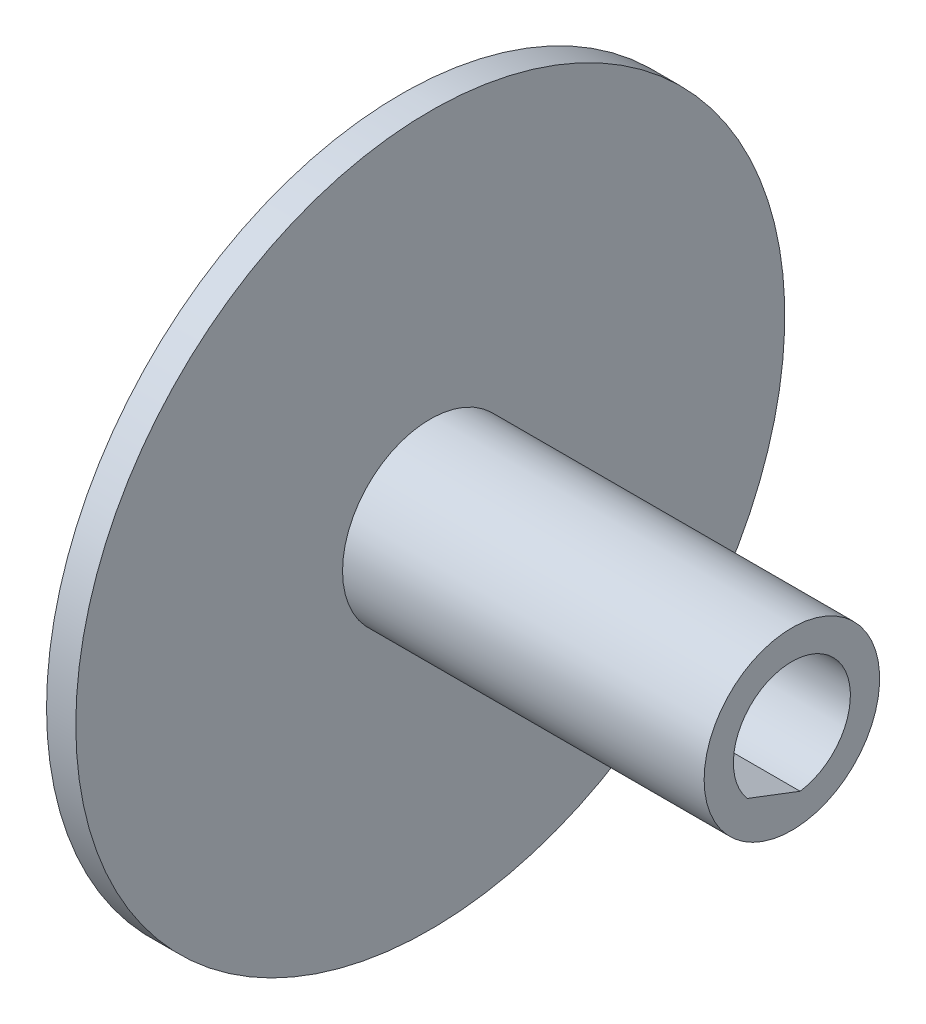
ISO-10303-21;
HEADER;
FILE_DESCRIPTION(('STEP AP214'),'2;1');
FILE_NAME('part.step','',(''),(''),'','','');
FILE_SCHEMA(('AUTOMOTIVE_DESIGN { 1 0 10303 214 1 1 1 1 }'));
ENDSEC;
DATA;
#1=APPLICATION_CONTEXT('core data for automotive mechanical design processes');
#2=APPLICATION_PROTOCOL_DEFINITION('international standard','automotive_design',2000,#1);
#3=PRODUCT_CONTEXT('',#1,'mechanical');
#4=PRODUCT('Part','Part','',(#3));
#5=PRODUCT_RELATED_PRODUCT_CATEGORY('part','',(#4));
#6=PRODUCT_DEFINITION_FORMATION('','',#4);
#7=PRODUCT_DEFINITION_CONTEXT('part definition',#1,'design');
#8=PRODUCT_DEFINITION('design','',#6,#7);
#9=PRODUCT_DEFINITION_SHAPE('','',#8);
#10=(LENGTH_UNIT() NAMED_UNIT(*) SI_UNIT(.MILLI.,.METRE.));
#11=(NAMED_UNIT(*) PLANE_ANGLE_UNIT() SI_UNIT($,.RADIAN.));
#12=(NAMED_UNIT(*) SI_UNIT($,.STERADIAN.) SOLID_ANGLE_UNIT());
#13=UNCERTAINTY_MEASURE_WITH_UNIT(LENGTH_MEASURE(1.E-05),#10,'distance_accuracy_value','');
#14=(GEOMETRIC_REPRESENTATION_CONTEXT(3) GLOBAL_UNCERTAINTY_ASSIGNED_CONTEXT((#13)) GLOBAL_UNIT_ASSIGNED_CONTEXT((#10,
#11,#12)) REPRESENTATION_CONTEXT('',''));
#15=CARTESIAN_POINT('',(0.,0.,0.));
#16=DIRECTION('',(0.,0.,1.));
#17=DIRECTION('',(1.,0.,0.));
#18=AXIS2_PLACEMENT_3D('',#15,#16,#17);
#19=CARTESIAN_POINT('',(2.,-2.98540145985401,0.));
#20=DIRECTION('',(-1.,0.,0.));
#21=DIRECTION('',(0.,0.,1.));
#22=AXIS2_PLACEMENT_3D('',#19,#20,#21);
#23=CYLINDRICAL_SURFACE('',#22,4.);
#24=CARTESIAN_POINT('',(2.,-2.98540145985401,0.));
#25=DIRECTION('',(-1.,0.,0.));
#26=DIRECTION('',(0.,0.,1.));
#27=AXIS2_PLACEMENT_3D('',#24,#25,#26);
#28=CIRCLE('',#27,4.);
#29=CARTESIAN_POINT('',(2.,-5.56523637391071,3.05686961060108));
#30=VERTEX_POINT('',#29);
#31=CARTESIAN_POINT('',(2.,-6.94576487212457,-0.561713132077882));
#32=VERTEX_POINT('',#31);
#33=EDGE_CURVE('E11',#30,#32,#28,.T.);
#34=ORIENTED_EDGE('',*,*,#33,.T.);
#35=DIRECTION('',(-1.,0.,0.));
#36=VECTOR('',#35,1.);
#37=CARTESIAN_POINT('',(32.6100738408527,-6.94576487212481,-0.561713132078517));
#38=LINE('',#37,#36);
#39=CARTESIAN_POINT('',(28.7227855910632,-6.94576487212457,-0.56171313207788));
#40=VERTEX_POINT('',#39);
#41=EDGE_CURVE('E61',#40,#32,#38,.T.);
#42=ORIENTED_EDGE('',*,*,#41,.F.);
#43=CARTESIAN_POINT('',(28.7227855910632,-2.98540145985401,0.));
#44=DIRECTION('',(-1.,0.,0.));
#45=DIRECTION('',(0.,0.,1.));
#46=AXIS2_PLACEMENT_3D('',#43,#44,#45);
#47=CIRCLE('',#46,4.);
#48=CARTESIAN_POINT('',(28.7227855910632,-5.56523637391092,3.05686961060052));
#49=VERTEX_POINT('',#48);
#50=EDGE_CURVE('E51',#49,#40,#47,.T.);
#51=ORIENTED_EDGE('',*,*,#50,.F.);
#52=DIRECTION('',(-1.,0.,0.));
#53=VECTOR('',#52,1.);
#54=CARTESIAN_POINT('',(32.6100738408527,-5.56523637391071,3.05686961060108));
#55=LINE('',#54,#53);
#56=EDGE_CURVE('E73',#49,#30,#55,.T.);
#57=ORIENTED_EDGE('',*,*,#56,.T.);
#58=EDGE_LOOP('',(#34,#42,#51,#57));
#59=FACE_BOUND('',#58,.T.);
#60=ADVANCED_FACE('F43',(#59),#23,.F.);
#61=CARTESIAN_POINT('',(28.7227855910632,1.01459854014599,0.));
#62=DIRECTION('',(-1.,0.,0.));
#63=DIRECTION('',(0.,0.,1.));
#64=AXIS2_PLACEMENT_3D('',#61,#62,#63);
#65=PLANE('',#64);
#66=CARTESIAN_POINT('',(28.7227855910632,-2.98540145985401,0.));
#67=DIRECTION('',(-1.,0.,0.));
#68=DIRECTION('',(0.,0.,1.));
#69=AXIS2_PLACEMENT_3D('',#66,#67,#68);
#70=CIRCLE('',#69,6.);
#71=CARTESIAN_POINT('',(28.7227855910632,-2.98540145985401,6.));
#72=VERTEX_POINT('',#71);
#73=EDGE_CURVE('E99',#72,#72,#70,.T.);
#74=ORIENTED_EDGE('',*,*,#73,.F.);
#75=EDGE_LOOP('',(#74));
#76=FACE_BOUND('',#75,.T.);
#77=ORIENTED_EDGE('',*,*,#50,.T.);
#78=DIRECTION('',(0.,0.356450925503198,0.934314046618113));
#79=VECTOR('',#78,1.);
#80=CARTESIAN_POINT('',(28.7227855910632,-6.94576487212481,-0.561713132078517));
#81=LINE('',#80,#79);
#82=EDGE_CURVE('E83',#40,#49,#81,.T.);
#83=ORIENTED_EDGE('',*,*,#82,.T.);
#84=EDGE_LOOP('',(#77,#83));
#85=FACE_BOUND('',#84,.T.);
#86=ADVANCED_FACE('F104',(#76,#85),#65,.F.);
#87=CARTESIAN_POINT('',(2.,-2.98540145985401,0.));
#88=DIRECTION('',(-1.,0.,0.));
#89=DIRECTION('',(0.,0.,1.));
#90=AXIS2_PLACEMENT_3D('',#87,#88,#89);
#91=CYLINDRICAL_SURFACE('',#90,6.);
#92=CARTESIAN_POINT('',(4.,-2.98540145985401,0.));
#93=DIRECTION('',(-1.,0.,0.));
#94=DIRECTION('',(0.,0.,1.));
#95=AXIS2_PLACEMENT_3D('',#92,#93,#94);
#96=CIRCLE('',#95,6.);
#97=CARTESIAN_POINT('',(4.,-2.98540145985401,6.));
#98=VERTEX_POINT('',#97);
#99=EDGE_CURVE('E95',#98,#98,#96,.T.);
#100=ORIENTED_EDGE('',*,*,#99,.F.);
#101=EDGE_LOOP('',(#100));
#102=FACE_BOUND('',#101,.T.);
#103=ORIENTED_EDGE('',*,*,#73,.T.);
#104=EDGE_LOOP('',(#103));
#105=FACE_BOUND('',#104,.T.);
#106=ADVANCED_FACE('F106',(#102,#105),#91,.T.);
#107=CARTESIAN_POINT('',(4.,21.2538194026265,0.));
#108=DIRECTION('',(-1.,0.,0.));
#109=DIRECTION('',(0.,0.,1.));
#110=AXIS2_PLACEMENT_3D('',#107,#108,#109);
#111=PLANE('',#110);
#112=CARTESIAN_POINT('',(4.,-2.98540145985401,0.));
#113=DIRECTION('',(-1.,0.,0.));
#114=DIRECTION('',(0.,0.,1.));
#115=AXIS2_PLACEMENT_3D('',#112,#113,#114);
#116=CIRCLE('',#115,24.2392208624805);
#117=CARTESIAN_POINT('',(4.,-2.98540145985401,24.2392208624805));
#118=VERTEX_POINT('',#117);
#119=EDGE_CURVE('E91',#118,#118,#116,.T.);
#120=ORIENTED_EDGE('',*,*,#119,.F.);
#121=EDGE_LOOP('',(#120));
#122=FACE_BOUND('',#121,.T.);
#123=ORIENTED_EDGE('',*,*,#99,.T.);
#124=EDGE_LOOP('',(#123));
#125=FACE_BOUND('',#124,.T.);
#126=ADVANCED_FACE('F112',(#122,#125),#111,.F.);
#127=CARTESIAN_POINT('',(2.,-2.98540145985401,0.));
#128=DIRECTION('',(-1.,0.,0.));
#129=DIRECTION('',(0.,0.,1.));
#130=AXIS2_PLACEMENT_3D('',#127,#128,#129);
#131=CYLINDRICAL_SURFACE('',#130,24.2392208624805);
#132=CARTESIAN_POINT('',(2.,-2.98540145985401,0.));
#133=DIRECTION('',(-1.,0.,0.));
#134=DIRECTION('',(0.,0.,1.));
#135=AXIS2_PLACEMENT_3D('',#132,#133,#134);
#136=CIRCLE('',#135,24.2392208624805);
#137=CARTESIAN_POINT('',(2.,-2.98540145985401,24.2392208624805));
#138=VERTEX_POINT('',#137);
#139=EDGE_CURVE('E87',#138,#138,#136,.T.);
#140=ORIENTED_EDGE('',*,*,#139,.F.);
#141=EDGE_LOOP('',(#140));
#142=FACE_BOUND('',#141,.T.);
#143=ORIENTED_EDGE('',*,*,#119,.T.);
#144=EDGE_LOOP('',(#143));
#145=FACE_BOUND('',#144,.T.);
#146=ADVANCED_FACE('F119',(#142,#145),#131,.T.);
#147=CARTESIAN_POINT('',(2.,5.01459854014599,0.));
#148=DIRECTION('',(1.,0.,0.));
#149=DIRECTION('',(0.,0.,-1.));
#150=AXIS2_PLACEMENT_3D('',#147,#148,#149);
#151=PLANE('',#150);
#152=ORIENTED_EDGE('',*,*,#33,.F.);
#153=DIRECTION('',(0.,-0.356450925503198,-0.934314046618113));
#154=VECTOR('',#153,1.);
#155=CARTESIAN_POINT('',(2.,-6.94576487212481,-0.561713132078517));
#156=LINE('',#155,#154);
#157=EDGE_CURVE('E71',#30,#32,#156,.T.);
#158=ORIENTED_EDGE('',*,*,#157,.T.);
#159=EDGE_LOOP('',(#152,#158));
#160=FACE_BOUND('',#159,.T.);
#161=ORIENTED_EDGE('',*,*,#139,.T.);
#162=EDGE_LOOP('',(#161));
#163=FACE_BOUND('',#162,.T.);
#164=ADVANCED_FACE('F68',(#160,#163),#151,.F.);
#165=CARTESIAN_POINT('',(32.6100738408527,-6.94576487212481,-0.561713132078517));
#166=DIRECTION('',(0.,0.934314046618113,-0.356450925503198));
#167=DIRECTION('',(0.,0.356450925503198,0.934314046618113));
#168=AXIS2_PLACEMENT_3D('',#165,#166,#167);
#169=PLANE('',#168);
#170=ORIENTED_EDGE('',*,*,#82,.F.);
#171=ORIENTED_EDGE('',*,*,#41,.T.);
#172=ORIENTED_EDGE('',*,*,#157,.F.);
#173=ORIENTED_EDGE('',*,*,#56,.F.);
#174=EDGE_LOOP('',(#170,#171,#172,#173));
#175=FACE_BOUND('',#174,.T.);
#176=ADVANCED_FACE('F78',(#175),#169,.T.);
#177=CLOSED_SHELL('',(#60,#86,#106,#126,#146,#164,#176));
#178=MANIFOLD_SOLID_BREP('B2',#177);
#179=ADVANCED_BREP_SHAPE_REPRESENTATION('',(#18,#178),#14);
#180=SHAPE_DEFINITION_REPRESENTATION(#9,#179);
ENDSEC;
END-ISO-10303-21;
